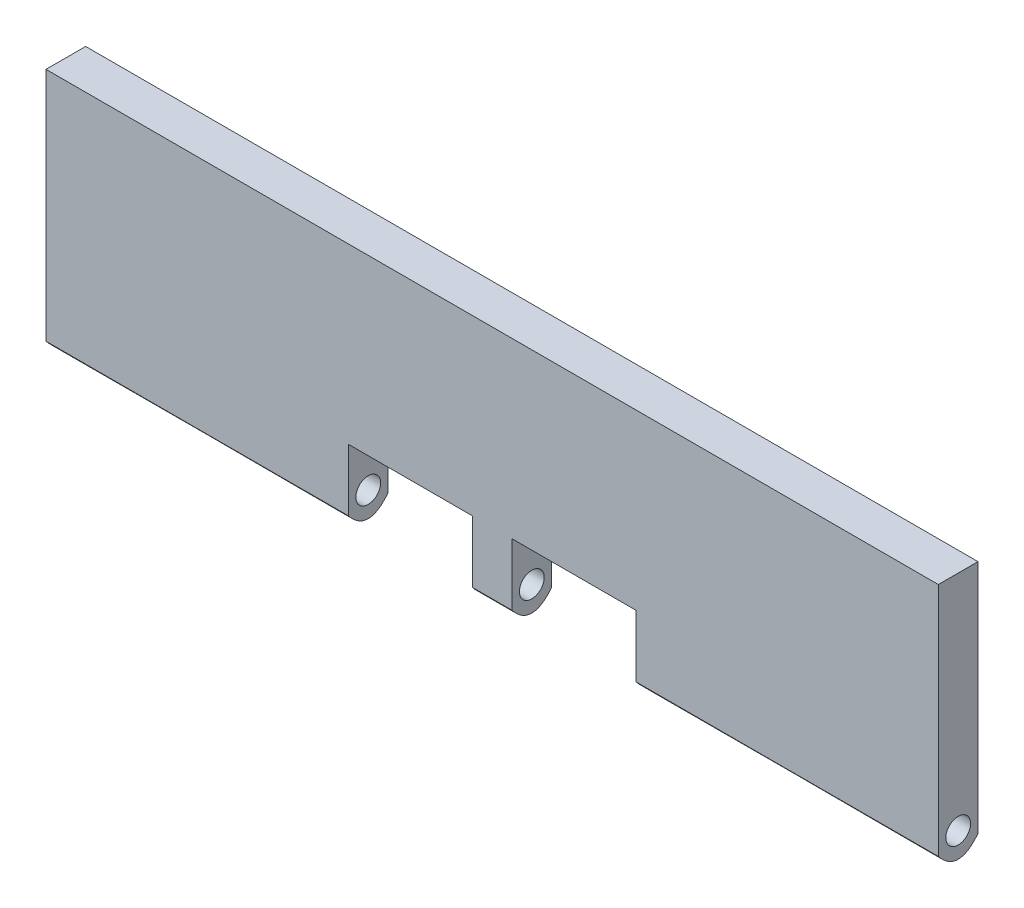
ISO-10303-21;
HEADER;
FILE_DESCRIPTION(('STEP AP214'),'2;1');
FILE_NAME('part.step','',(''),(''),'','','');
FILE_SCHEMA(('AUTOMOTIVE_DESIGN { 1 0 10303 214 1 1 1 1 }'));
ENDSEC;
DATA;
#1=APPLICATION_CONTEXT('core data for automotive mechanical design processes');
#2=APPLICATION_PROTOCOL_DEFINITION('international standard','automotive_design',2000,#1);
#3=PRODUCT_CONTEXT('',#1,'mechanical');
#4=PRODUCT('Part','Part','',(#3));
#5=PRODUCT_RELATED_PRODUCT_CATEGORY('part','',(#4));
#6=PRODUCT_DEFINITION_FORMATION('','',#4);
#7=PRODUCT_DEFINITION_CONTEXT('part definition',#1,'design');
#8=PRODUCT_DEFINITION('design','',#6,#7);
#9=PRODUCT_DEFINITION_SHAPE('','',#8);
#10=(LENGTH_UNIT() NAMED_UNIT(*) SI_UNIT(.MILLI.,.METRE.));
#11=(NAMED_UNIT(*) PLANE_ANGLE_UNIT() SI_UNIT($,.RADIAN.));
#12=(NAMED_UNIT(*) SI_UNIT($,.STERADIAN.) SOLID_ANGLE_UNIT());
#13=UNCERTAINTY_MEASURE_WITH_UNIT(LENGTH_MEASURE(1.E-05),#10,'distance_accuracy_value','');
#14=(GEOMETRIC_REPRESENTATION_CONTEXT(3) GLOBAL_UNCERTAINTY_ASSIGNED_CONTEXT((#13)) GLOBAL_UNIT_ASSIGNED_CONTEXT((#10,
#11,#12)) REPRESENTATION_CONTEXT('',''));
#15=CARTESIAN_POINT('',(0.,0.,0.));
#16=DIRECTION('',(0.,0.,1.));
#17=DIRECTION('',(1.,0.,0.));
#18=AXIS2_PLACEMENT_3D('',#15,#16,#17);
#19=CARTESIAN_POINT('',(0.,0.,0.));
#20=DIRECTION('',(0.,0.,-1.));
#21=DIRECTION('',(-1.,0.,0.));
#22=AXIS2_PLACEMENT_3D('',#19,#20,#21);
#23=PLANE('',#22);
#24=DIRECTION('',(0.,1.,0.));
#25=VECTOR('',#24,1.);
#26=CARTESIAN_POINT('',(90.,-25.,0.));
#27=LINE('',#26,#25);
#28=CARTESIAN_POINT('',(90.,-22.5,0.));
#29=VERTEX_POINT('',#28);
#30=CARTESIAN_POINT('',(90.,25.,0.));
#31=VERTEX_POINT('',#30);
#32=EDGE_CURVE('E324',#29,#31,#27,.T.);
#33=ORIENTED_EDGE('',*,*,#32,.F.);
#34=DIRECTION('',(-1.,0.,0.));
#35=VECTOR('',#34,1.);
#36=CARTESIAN_POINT('',(97.0710678118654,-22.5,0.));
#37=LINE('',#36,#35);
#38=CARTESIAN_POINT('',(29.,-22.5,0.));
#39=VERTEX_POINT('',#38);
#40=EDGE_CURVE('E239',#29,#39,#37,.T.);
#41=ORIENTED_EDGE('',*,*,#40,.T.);
#42=DIRECTION('',(0.,-1.,0.));
#43=VECTOR('',#42,1.);
#44=CARTESIAN_POINT('',(29.,-25.,0.));
#45=LINE('',#44,#43);
#46=CARTESIAN_POINT('',(28.9999999999999,-10.,0.));
#47=VERTEX_POINT('',#46);
#48=EDGE_CURVE('E350',#47,#39,#45,.T.);
#49=ORIENTED_EDGE('',*,*,#48,.F.);
#50=DIRECTION('',(1.,0.,0.));
#51=VECTOR('',#50,1.);
#52=CARTESIAN_POINT('',(28.9999999999999,-10.,0.));
#53=LINE('',#52,#51);
#54=CARTESIAN_POINT('',(3.99999999999994,-10.,0.));
#55=VERTEX_POINT('',#54);
#56=EDGE_CURVE('E348',#55,#47,#53,.T.);
#57=ORIENTED_EDGE('',*,*,#56,.F.);
#58=DIRECTION('',(0.,1.,0.));
#59=VECTOR('',#58,1.);
#60=CARTESIAN_POINT('',(3.99999999999994,-10.,0.));
#61=LINE('',#60,#59);
#62=CARTESIAN_POINT('',(3.99999999999998,-22.5,0.));
#63=VERTEX_POINT('',#62);
#64=EDGE_CURVE('E346',#63,#55,#61,.T.);
#65=ORIENTED_EDGE('',*,*,#64,.F.);
#66=DIRECTION('',(-1.,0.,0.));
#67=VECTOR('',#66,1.);
#68=CARTESIAN_POINT('',(0.,-22.5,0.));
#69=LINE('',#68,#67);
#70=CARTESIAN_POINT('',(-4.,-22.5,0.));
#71=VERTEX_POINT('',#70);
#72=EDGE_CURVE('E12',#63,#71,#69,.T.);
#73=ORIENTED_EDGE('',*,*,#72,.T.);
#74=DIRECTION('',(0.,-1.,0.));
#75=VECTOR('',#74,1.);
#76=CARTESIAN_POINT('',(-4.,-10.,0.));
#77=LINE('',#76,#75);
#78=CARTESIAN_POINT('',(-4.,-10.,0.));
#79=VERTEX_POINT('',#78);
#80=EDGE_CURVE('E343',#79,#71,#77,.T.);
#81=ORIENTED_EDGE('',*,*,#80,.F.);
#82=DIRECTION('',(1.,0.,0.));
#83=VECTOR('',#82,1.);
#84=CARTESIAN_POINT('',(-29.,-10.,0.));
#85=LINE('',#84,#83);
#86=CARTESIAN_POINT('',(-29.,-10.,0.));
#87=VERTEX_POINT('',#86);
#88=EDGE_CURVE('E338',#87,#79,#85,.T.);
#89=ORIENTED_EDGE('',*,*,#88,.F.);
#90=DIRECTION('',(0.,1.,0.));
#91=VECTOR('',#90,1.);
#92=CARTESIAN_POINT('',(-29.,-25.,0.));
#93=LINE('',#92,#91);
#94=CARTESIAN_POINT('',(-29.,-22.5,0.));
#95=VERTEX_POINT('',#94);
#96=EDGE_CURVE('E336',#95,#87,#93,.T.);
#97=ORIENTED_EDGE('',*,*,#96,.F.);
#98=CARTESIAN_POINT('',(-90.,-22.5,0.));
#99=VERTEX_POINT('',#98);
#100=EDGE_CURVE('E76',#95,#99,#69,.T.);
#101=ORIENTED_EDGE('',*,*,#100,.T.);
#102=DIRECTION('',(0.,-1.,0.));
#103=VECTOR('',#102,1.);
#104=CARTESIAN_POINT('',(-90.,-25.,0.));
#105=LINE('',#104,#103);
#106=CARTESIAN_POINT('',(-90.,25.,0.));
#107=VERTEX_POINT('',#106);
#108=EDGE_CURVE('E323',#107,#99,#105,.T.);
#109=ORIENTED_EDGE('',*,*,#108,.F.);
#110=DIRECTION('',(-1.,0.,0.));
#111=VECTOR('',#110,1.);
#112=CARTESIAN_POINT('',(-90.,25.,0.));
#113=LINE('',#112,#111);
#114=EDGE_CURVE('E314',#31,#107,#113,.T.);
#115=ORIENTED_EDGE('',*,*,#114,.F.);
#116=EDGE_LOOP('',(#33,#41,#49,#57,#65,#73,#81,#89,#97,#101,#109,#115));
#117=FACE_BOUND('',#116,.T.);
#118=DIRECTION('',(1.,0.,0.));
#119=VECTOR('',#118,1.);
#120=CARTESIAN_POINT('',(-2.5,4.5,0.));
#121=LINE('',#120,#119);
#122=CARTESIAN_POINT('',(-2.5,4.5,0.));
#123=VERTEX_POINT('',#122);
#124=CARTESIAN_POINT('',(2.5,4.5,0.));
#125=VERTEX_POINT('',#124);
#126=EDGE_CURVE('E88',#123,#125,#121,.T.);
#127=ORIENTED_EDGE('',*,*,#126,.F.);
#128=DIRECTION('',(0.,-1.,0.));
#129=VECTOR('',#128,1.);
#130=CARTESIAN_POINT('',(-2.5,4.5,0.));
#131=LINE('',#130,#129);
#132=CARTESIAN_POINT('',(-2.5,-4.5,0.));
#133=VERTEX_POINT('',#132);
#134=EDGE_CURVE('E83',#123,#133,#131,.T.);
#135=ORIENTED_EDGE('',*,*,#134,.T.);
#136=DIRECTION('',(1.,0.,0.));
#137=VECTOR('',#136,1.);
#138=CARTESIAN_POINT('',(-2.5,-4.5,0.));
#139=LINE('',#138,#137);
#140=CARTESIAN_POINT('',(2.5,-4.5,0.));
#141=VERTEX_POINT('',#140);
#142=EDGE_CURVE('E222',#133,#141,#139,.T.);
#143=ORIENTED_EDGE('',*,*,#142,.T.);
#144=DIRECTION('',(0.,-1.,0.));
#145=VECTOR('',#144,1.);
#146=CARTESIAN_POINT('',(2.5,4.5,0.));
#147=LINE('',#146,#145);
#148=EDGE_CURVE('E196',#125,#141,#147,.T.);
#149=ORIENTED_EDGE('',*,*,#148,.F.);
#150=EDGE_LOOP('',(#127,#135,#143,#149));
#151=FACE_BOUND('',#150,.T.);
#152=ADVANCED_FACE('F67',(#117,#151),#23,.T.);
#153=CARTESIAN_POINT('',(90.,-25.,8.));
#154=DIRECTION('',(-1.,0.,0.));
#155=DIRECTION('',(0.,0.,1.));
#156=AXIS2_PLACEMENT_3D('',#153,#154,#155);
#157=PLANE('',#156);
#158=CARTESIAN_POINT('',(90.,-20.,4.));
#159=DIRECTION('',(-1.,0.,0.));
#160=DIRECTION('',(0.,0.,1.));
#161=AXIS2_PLACEMENT_3D('',#158,#159,#160);
#162=CIRCLE('',#161,2.5);
#163=CARTESIAN_POINT('',(90.,-20.,6.5));
#164=VERTEX_POINT('',#163);
#165=EDGE_CURVE('E227',#164,#164,#162,.F.);
#166=ORIENTED_EDGE('',*,*,#165,.F.);
#167=EDGE_LOOP('',(#166));
#168=FACE_BOUND('',#167,.T.);
#169=CARTESIAN_POINT('',(90.,-22.5,0.));
#170=CARTESIAN_POINT('',(90.,-27.5,4.));
#171=CARTESIAN_POINT('',(90.,-22.5,8.));
#172=B_SPLINE_CURVE_WITH_KNOTS('',2,(#169,#170,#171),.UNSPECIFIED.,.F.,.F.,(3,3),(0.,1.),.UNSPECIFIED.);
#173=CARTESIAN_POINT('',(90.,-22.5,8.));
#174=VERTEX_POINT('',#173);
#175=EDGE_CURVE('E243',#174,#29,#172,.F.);
#176=ORIENTED_EDGE('',*,*,#175,.T.);
#177=ORIENTED_EDGE('',*,*,#32,.T.);
#178=DIRECTION('',(0.,0.,-1.));
#179=VECTOR('',#178,1.);
#180=CARTESIAN_POINT('',(90.,25.,8.));
#181=LINE('',#180,#179);
#182=CARTESIAN_POINT('',(90.,25.,8.));
#183=VERTEX_POINT('',#182);
#184=EDGE_CURVE('E320',#183,#31,#181,.T.);
#185=ORIENTED_EDGE('',*,*,#184,.F.);
#186=DIRECTION('',(0.,1.,0.));
#187=VECTOR('',#186,1.);
#188=CARTESIAN_POINT('',(90.,-25.,8.));
#189=LINE('',#188,#187);
#190=EDGE_CURVE('E353',#174,#183,#189,.T.);
#191=ORIENTED_EDGE('',*,*,#190,.F.);
#192=EDGE_LOOP('',(#176,#177,#185,#191));
#193=FACE_BOUND('',#192,.T.);
#194=ADVANCED_FACE('F69',(#168,#193),#157,.F.);
#195=CARTESIAN_POINT('',(-90.,-25.,8.));
#196=DIRECTION('',(1.,0.,0.));
#197=DIRECTION('',(0.,0.,-1.));
#198=AXIS2_PLACEMENT_3D('',#195,#196,#197);
#199=PLANE('',#198);
#200=CARTESIAN_POINT('',(-90.,-20.,4.));
#201=DIRECTION('',(-1.,0.,0.));
#202=DIRECTION('',(0.,0.,1.));
#203=AXIS2_PLACEMENT_3D('',#200,#201,#202);
#204=CIRCLE('',#203,2.5);
#205=CARTESIAN_POINT('',(-90.,-20.,6.5));
#206=VERTEX_POINT('',#205);
#207=EDGE_CURVE('E221',#206,#206,#204,.T.);
#208=ORIENTED_EDGE('',*,*,#207,.F.);
#209=EDGE_LOOP('',(#208));
#210=FACE_BOUND('',#209,.T.);
#211=ORIENTED_EDGE('',*,*,#108,.T.);
#212=CARTESIAN_POINT('',(-90.,-22.5,0.));
#213=CARTESIAN_POINT('',(-90.,-27.5,4.));
#214=CARTESIAN_POINT('',(-90.,-22.5,8.));
#215=B_SPLINE_CURVE_WITH_KNOTS('',2,(#212,#213,#214),.UNSPECIFIED.,.F.,.F.,(3,3),(0.,1.),.UNSPECIFIED.);
#216=CARTESIAN_POINT('',(-90.,-22.5,8.));
#217=VERTEX_POINT('',#216);
#218=EDGE_CURVE('E242',#99,#217,#215,.T.);
#219=ORIENTED_EDGE('',*,*,#218,.T.);
#220=DIRECTION('',(0.,-1.,0.));
#221=VECTOR('',#220,1.);
#222=CARTESIAN_POINT('',(-90.,-25.,8.));
#223=LINE('',#222,#221);
#224=CARTESIAN_POINT('',(-90.,25.,8.));
#225=VERTEX_POINT('',#224);
#226=EDGE_CURVE('E330',#225,#217,#223,.T.);
#227=ORIENTED_EDGE('',*,*,#226,.F.);
#228=DIRECTION('',(0.,0.,-1.));
#229=VECTOR('',#228,1.);
#230=CARTESIAN_POINT('',(-90.,25.,8.));
#231=LINE('',#230,#229);
#232=EDGE_CURVE('E317',#225,#107,#231,.T.);
#233=ORIENTED_EDGE('',*,*,#232,.T.);
#234=EDGE_LOOP('',(#211,#219,#227,#233));
#235=FACE_BOUND('',#234,.T.);
#236=ADVANCED_FACE('F303',(#210,#235),#199,.F.);
#237=CARTESIAN_POINT('',(-29.,-25.,8.));
#238=DIRECTION('',(-1.,0.,0.));
#239=DIRECTION('',(0.,-1.,0.));
#240=AXIS2_PLACEMENT_3D('',#237,#238,#239);
#241=PLANE('',#240);
#242=CARTESIAN_POINT('',(-29.,-20.,4.));
#243=DIRECTION('',(-1.,0.,0.));
#244=DIRECTION('',(0.,-1.,0.));
#245=AXIS2_PLACEMENT_3D('',#242,#243,#244);
#246=CIRCLE('',#245,2.5);
#247=CARTESIAN_POINT('',(-29.,-22.5,4.));
#248=VERTEX_POINT('',#247);
#249=EDGE_CURVE('E236',#248,#248,#246,.T.);
#250=ORIENTED_EDGE('',*,*,#249,.T.);
#251=EDGE_LOOP('',(#250));
#252=FACE_BOUND('',#251,.T.);
#253=CARTESIAN_POINT('',(-29.,-22.5,0.));
#254=CARTESIAN_POINT('',(-29.,-27.5,4.));
#255=CARTESIAN_POINT('',(-29.,-22.5,8.));
#256=B_SPLINE_CURVE_WITH_KNOTS('',2,(#253,#254,#255),.UNSPECIFIED.,.F.,.F.,(3,3),(0.,1.),.UNSPECIFIED.);
#257=CARTESIAN_POINT('',(-29.,-22.5,8.));
#258=VERTEX_POINT('',#257);
#259=EDGE_CURVE('E381',#95,#258,#256,.T.);
#260=ORIENTED_EDGE('',*,*,#259,.F.);
#261=ORIENTED_EDGE('',*,*,#96,.T.);
#262=DIRECTION('',(0.,0.,-1.));
#263=VECTOR('',#262,1.);
#264=CARTESIAN_POINT('',(-29.,-10.,8.));
#265=LINE('',#264,#263);
#266=CARTESIAN_POINT('',(-29.,-10.,8.));
#267=VERTEX_POINT('',#266);
#268=EDGE_CURVE('E331',#267,#87,#265,.T.);
#269=ORIENTED_EDGE('',*,*,#268,.F.);
#270=DIRECTION('',(0.,1.,0.));
#271=VECTOR('',#270,1.);
#272=CARTESIAN_POINT('',(-29.,-25.,8.));
#273=LINE('',#272,#271);
#274=EDGE_CURVE('E391',#258,#267,#273,.T.);
#275=ORIENTED_EDGE('',*,*,#274,.F.);
#276=EDGE_LOOP('',(#260,#261,#269,#275));
#277=FACE_BOUND('',#276,.T.);
#278=ADVANCED_FACE('F296',(#252,#277),#241,.F.);
#279=CARTESIAN_POINT('',(-4.,-10.,8.));
#280=DIRECTION('',(1.,0.,0.));
#281=DIRECTION('',(0.,1.,0.));
#282=AXIS2_PLACEMENT_3D('',#279,#280,#281);
#283=PLANE('',#282);
#284=CARTESIAN_POINT('',(-4.,-20.,4.));
#285=DIRECTION('',(1.,0.,0.));
#286=DIRECTION('',(0.,1.,0.));
#287=AXIS2_PLACEMENT_3D('',#284,#285,#286);
#288=CIRCLE('',#287,2.5);
#289=CARTESIAN_POINT('',(-4.,-17.5,4.));
#290=VERTEX_POINT('',#289);
#291=EDGE_CURVE('E233',#290,#290,#288,.T.);
#292=ORIENTED_EDGE('',*,*,#291,.T.);
#293=EDGE_LOOP('',(#292));
#294=FACE_BOUND('',#293,.T.);
#295=ORIENTED_EDGE('',*,*,#80,.T.);
#296=CARTESIAN_POINT('',(-4.,-22.5,0.));
#297=CARTESIAN_POINT('',(-4.,-27.5,4.));
#298=CARTESIAN_POINT('',(-4.,-22.5,8.));
#299=B_SPLINE_CURVE_WITH_KNOTS('',2,(#296,#297,#298),.UNSPECIFIED.,.F.,.F.,(3,3),(0.,1.),.UNSPECIFIED.);
#300=CARTESIAN_POINT('',(-4.,-22.5,8.));
#301=VERTEX_POINT('',#300);
#302=EDGE_CURVE('E373',#301,#71,#299,.F.);
#303=ORIENTED_EDGE('',*,*,#302,.F.);
#304=DIRECTION('',(0.,-1.,0.));
#305=VECTOR('',#304,1.);
#306=CARTESIAN_POINT('',(-4.,-10.,8.));
#307=LINE('',#306,#305);
#308=CARTESIAN_POINT('',(-4.,-10.,8.));
#309=VERTEX_POINT('',#308);
#310=EDGE_CURVE('E379',#309,#301,#307,.T.);
#311=ORIENTED_EDGE('',*,*,#310,.F.);
#312=DIRECTION('',(0.,0.,-1.));
#313=VECTOR('',#312,1.);
#314=CARTESIAN_POINT('',(-4.,-10.,8.));
#315=LINE('',#314,#313);
#316=EDGE_CURVE('E361',#309,#79,#315,.T.);
#317=ORIENTED_EDGE('',*,*,#316,.T.);
#318=EDGE_LOOP('',(#295,#303,#311,#317));
#319=FACE_BOUND('',#318,.T.);
#320=ADVANCED_FACE('F292',(#294,#319),#283,.F.);
#321=CARTESIAN_POINT('',(3.99999999999994,-10.,8.));
#322=DIRECTION('',(-1.,0.,0.));
#323=DIRECTION('',(0.,-1.,0.));
#324=AXIS2_PLACEMENT_3D('',#321,#322,#323);
#325=PLANE('',#324);
#326=CARTESIAN_POINT('',(3.99999999999999,-20.,4.));
#327=DIRECTION('',(-1.,0.,0.));
#328=DIRECTION('',(0.,-1.,0.));
#329=AXIS2_PLACEMENT_3D('',#326,#327,#328);
#330=CIRCLE('',#329,2.5);
#331=CARTESIAN_POINT('',(4.,-22.5,4.));
#332=VERTEX_POINT('',#331);
#333=EDGE_CURVE('E230',#332,#332,#330,.T.);
#334=ORIENTED_EDGE('',*,*,#333,.T.);
#335=EDGE_LOOP('',(#334));
#336=FACE_BOUND('',#335,.T.);
#337=CARTESIAN_POINT('',(3.99999999999995,-22.5,0.));
#338=CARTESIAN_POINT('',(3.99999999999995,-27.5,4.));
#339=CARTESIAN_POINT('',(3.99999999999995,-22.5,8.));
#340=B_SPLINE_CURVE_WITH_KNOTS('',2,(#337,#338,#339),.UNSPECIFIED.,.F.,.F.,(3,3),(0.,1.),.UNSPECIFIED.);
#341=CARTESIAN_POINT('',(3.99999999999999,-22.5,8.));
#342=VERTEX_POINT('',#341);
#343=EDGE_CURVE('E374',#63,#342,#340,.T.);
#344=ORIENTED_EDGE('',*,*,#343,.F.);
#345=ORIENTED_EDGE('',*,*,#64,.T.);
#346=DIRECTION('',(0.,0.,-1.));
#347=VECTOR('',#346,1.);
#348=CARTESIAN_POINT('',(3.99999999999994,-10.,8.));
#349=LINE('',#348,#347);
#350=CARTESIAN_POINT('',(3.99999999999994,-10.,8.));
#351=VERTEX_POINT('',#350);
#352=EDGE_CURVE('E357',#351,#55,#349,.T.);
#353=ORIENTED_EDGE('',*,*,#352,.F.);
#354=DIRECTION('',(0.,1.,0.));
#355=VECTOR('',#354,1.);
#356=CARTESIAN_POINT('',(3.99999999999994,-10.,8.));
#357=LINE('',#356,#355);
#358=EDGE_CURVE('E387',#342,#351,#357,.T.);
#359=ORIENTED_EDGE('',*,*,#358,.F.);
#360=EDGE_LOOP('',(#344,#345,#353,#359));
#361=FACE_BOUND('',#360,.T.);
#362=ADVANCED_FACE('F284',(#336,#361),#325,.F.);
#363=CARTESIAN_POINT('',(29.,-25.,8.));
#364=DIRECTION('',(1.,0.,0.));
#365=DIRECTION('',(0.,1.,0.));
#366=AXIS2_PLACEMENT_3D('',#363,#364,#365);
#367=PLANE('',#366);
#368=CARTESIAN_POINT('',(29.,-20.,4.));
#369=DIRECTION('',(1.,0.,0.));
#370=DIRECTION('',(0.,1.,0.));
#371=AXIS2_PLACEMENT_3D('',#368,#369,#370);
#372=CIRCLE('',#371,2.5);
#373=CARTESIAN_POINT('',(29.,-17.5,4.));
#374=VERTEX_POINT('',#373);
#375=EDGE_CURVE('E71',#374,#374,#372,.T.);
#376=ORIENTED_EDGE('',*,*,#375,.T.);
#377=EDGE_LOOP('',(#376));
#378=FACE_BOUND('',#377,.T.);
#379=ORIENTED_EDGE('',*,*,#48,.T.);
#380=CARTESIAN_POINT('',(29.,-22.5,0.));
#381=CARTESIAN_POINT('',(29.,-27.5,4.));
#382=CARTESIAN_POINT('',(29.,-22.5,8.));
#383=B_SPLINE_CURVE_WITH_KNOTS('',2,(#380,#381,#382),.UNSPECIFIED.,.F.,.F.,(3,3),(0.,1.),.UNSPECIFIED.);
#384=CARTESIAN_POINT('',(29.,-22.5,8.));
#385=VERTEX_POINT('',#384);
#386=EDGE_CURVE('E247',#385,#39,#383,.F.);
#387=ORIENTED_EDGE('',*,*,#386,.F.);
#388=DIRECTION('',(0.,-1.,0.));
#389=VECTOR('',#388,1.);
#390=CARTESIAN_POINT('',(29.,-25.,8.));
#391=LINE('',#390,#389);
#392=CARTESIAN_POINT('',(28.9999999999999,-10.,8.));
#393=VERTEX_POINT('',#392);
#394=EDGE_CURVE('E358',#393,#385,#391,.T.);
#395=ORIENTED_EDGE('',*,*,#394,.F.);
#396=DIRECTION('',(0.,0.,-1.));
#397=VECTOR('',#396,1.);
#398=CARTESIAN_POINT('',(28.9999999999999,-10.,8.));
#399=LINE('',#398,#397);
#400=EDGE_CURVE('E354',#393,#47,#399,.T.);
#401=ORIENTED_EDGE('',*,*,#400,.T.);
#402=EDGE_LOOP('',(#379,#387,#395,#401));
#403=FACE_BOUND('',#402,.T.);
#404=ADVANCED_FACE('F277',(#378,#403),#367,.F.);
#405=CARTESIAN_POINT('',(0.,0.,8.));
#406=DIRECTION('',(0.,0.,-1.));
#407=DIRECTION('',(-1.,0.,0.));
#408=AXIS2_PLACEMENT_3D('',#405,#406,#407);
#409=PLANE('',#408);
#410=DIRECTION('',(-1.,0.,0.));
#411=VECTOR('',#410,1.);
#412=CARTESIAN_POINT('',(97.0710678118654,-22.5,8.));
#413=LINE('',#412,#411);
#414=EDGE_CURVE('E248',#174,#385,#413,.T.);
#415=ORIENTED_EDGE('',*,*,#414,.F.);
#416=ORIENTED_EDGE('',*,*,#190,.T.);
#417=DIRECTION('',(-1.,0.,0.));
#418=VECTOR('',#417,1.);
#419=CARTESIAN_POINT('',(-90.,25.,8.));
#420=LINE('',#419,#418);
#421=EDGE_CURVE('E410',#183,#225,#420,.T.);
#422=ORIENTED_EDGE('',*,*,#421,.T.);
#423=ORIENTED_EDGE('',*,*,#226,.T.);
#424=DIRECTION('',(-1.,0.,0.));
#425=VECTOR('',#424,1.);
#426=CARTESIAN_POINT('',(0.,-22.5,8.));
#427=LINE('',#426,#425);
#428=EDGE_CURVE('E367',#258,#217,#427,.T.);
#429=ORIENTED_EDGE('',*,*,#428,.F.);
#430=ORIENTED_EDGE('',*,*,#274,.T.);
#431=DIRECTION('',(1.,0.,0.));
#432=VECTOR('',#431,1.);
#433=CARTESIAN_POINT('',(-29.,-10.,8.));
#434=LINE('',#433,#432);
#435=EDGE_CURVE('E385',#267,#309,#434,.T.);
#436=ORIENTED_EDGE('',*,*,#435,.T.);
#437=ORIENTED_EDGE('',*,*,#310,.T.);
#438=EDGE_CURVE('E368',#342,#301,#427,.T.);
#439=ORIENTED_EDGE('',*,*,#438,.F.);
#440=ORIENTED_EDGE('',*,*,#358,.T.);
#441=DIRECTION('',(1.,0.,0.));
#442=VECTOR('',#441,1.);
#443=CARTESIAN_POINT('',(28.9999999999999,-10.,8.));
#444=LINE('',#443,#442);
#445=EDGE_CURVE('E389',#351,#393,#444,.T.);
#446=ORIENTED_EDGE('',*,*,#445,.T.);
#447=ORIENTED_EDGE('',*,*,#394,.T.);
#448=EDGE_LOOP('',(#415,#416,#422,#423,#429,#430,#436,#437,#439,#440,#446,#447));
#449=FACE_BOUND('',#448,.T.);
#450=ADVANCED_FACE('F273',(#449),#409,.F.);
#451=CARTESIAN_POINT('',(-90.,25.,8.));
#452=DIRECTION('',(0.,-1.,0.));
#453=DIRECTION('',(0.,0.,-1.));
#454=AXIS2_PLACEMENT_3D('',#451,#452,#453);
#455=PLANE('',#454);
#456=ORIENTED_EDGE('',*,*,#114,.T.);
#457=ORIENTED_EDGE('',*,*,#232,.F.);
#458=ORIENTED_EDGE('',*,*,#421,.F.);
#459=ORIENTED_EDGE('',*,*,#184,.T.);
#460=EDGE_LOOP('',(#456,#457,#458,#459));
#461=FACE_BOUND('',#460,.T.);
#462=ADVANCED_FACE('F276',(#461),#455,.F.);
#463=CARTESIAN_POINT('',(-29.,-10.,8.));
#464=DIRECTION('',(0.,1.,0.));
#465=DIRECTION('',(0.,0.,1.));
#466=AXIS2_PLACEMENT_3D('',#463,#464,#465);
#467=PLANE('',#466);
#468=ORIENTED_EDGE('',*,*,#88,.T.);
#469=ORIENTED_EDGE('',*,*,#316,.F.);
#470=ORIENTED_EDGE('',*,*,#435,.F.);
#471=ORIENTED_EDGE('',*,*,#268,.T.);
#472=EDGE_LOOP('',(#468,#469,#470,#471));
#473=FACE_BOUND('',#472,.T.);
#474=ADVANCED_FACE('F288',(#473),#467,.F.);
#475=CARTESIAN_POINT('',(28.9999999999999,-10.,8.));
#476=DIRECTION('',(0.,1.,0.));
#477=DIRECTION('',(-1.,0.,0.));
#478=AXIS2_PLACEMENT_3D('',#475,#476,#477);
#479=PLANE('',#478);
#480=ORIENTED_EDGE('',*,*,#56,.T.);
#481=ORIENTED_EDGE('',*,*,#400,.F.);
#482=ORIENTED_EDGE('',*,*,#445,.F.);
#483=ORIENTED_EDGE('',*,*,#352,.T.);
#484=EDGE_LOOP('',(#480,#481,#482,#483));
#485=FACE_BOUND('',#484,.T.);
#486=ADVANCED_FACE('F268',(#485),#479,.F.);
#487=CARTESIAN_POINT('',(97.0710678118654,-22.5,0.));
#488=CARTESIAN_POINT('',(97.0710678118654,-27.5,4.));
#489=CARTESIAN_POINT('',(97.0710678118654,-22.5,8.));
#490=B_SPLINE_CURVE_WITH_KNOTS('',2,(#487,#488,#489),.UNSPECIFIED.,.F.,.F.,(3,3),(0.,1.),.UNSPECIFIED.);
#491=DIRECTION('',(-1.,0.,0.));
#492=VECTOR('',#491,1.);
#493=SURFACE_OF_LINEAR_EXTRUSION('',#490,#492);
#494=ORIENTED_EDGE('',*,*,#259,.T.);
#495=ORIENTED_EDGE('',*,*,#428,.T.);
#496=ORIENTED_EDGE('',*,*,#218,.F.);
#497=ORIENTED_EDGE('',*,*,#100,.F.);
#498=EDGE_LOOP('',(#494,#495,#496,#497));
#499=FACE_BOUND('',#498,.T.);
#500=ADVANCED_FACE('F263',(#499),#493,.T.);
#501=ORIENTED_EDGE('',*,*,#302,.T.);
#502=ORIENTED_EDGE('',*,*,#72,.F.);
#503=ORIENTED_EDGE('',*,*,#343,.T.);
#504=ORIENTED_EDGE('',*,*,#438,.T.);
#505=EDGE_LOOP('',(#501,#502,#503,#504));
#506=FACE_BOUND('',#505,.T.);
#507=ADVANCED_FACE('F267',(#506),#493,.T.);
#508=ORIENTED_EDGE('',*,*,#386,.T.);
#509=ORIENTED_EDGE('',*,*,#40,.F.);
#510=ORIENTED_EDGE('',*,*,#175,.F.);
#511=ORIENTED_EDGE('',*,*,#414,.T.);
#512=EDGE_LOOP('',(#508,#509,#510,#511));
#513=FACE_BOUND('',#512,.T.);
#514=ADVANCED_FACE('F270',(#513),#493,.T.);
#515=CARTESIAN_POINT('',(97.0710678118654,-20.,4.));
#516=DIRECTION('',(-1.,0.,0.));
#517=DIRECTION('',(0.,0.,1.));
#518=AXIS2_PLACEMENT_3D('',#515,#516,#517);
#519=CYLINDRICAL_SURFACE('',#518,2.5);
#520=ORIENTED_EDGE('',*,*,#165,.T.);
#521=EDGE_LOOP('',(#520));
#522=FACE_BOUND('',#521,.T.);
#523=ORIENTED_EDGE('',*,*,#375,.F.);
#524=EDGE_LOOP('',(#523));
#525=FACE_BOUND('',#524,.T.);
#526=ADVANCED_FACE('F441',(#522,#525),#519,.F.);
#527=ORIENTED_EDGE('',*,*,#333,.F.);
#528=EDGE_LOOP('',(#527));
#529=FACE_BOUND('',#528,.T.);
#530=ORIENTED_EDGE('',*,*,#291,.F.);
#531=EDGE_LOOP('',(#530));
#532=FACE_BOUND('',#531,.T.);
#533=ADVANCED_FACE('F446',(#529,#532),#519,.F.);
#534=ORIENTED_EDGE('',*,*,#207,.T.);
#535=EDGE_LOOP('',(#534));
#536=FACE_BOUND('',#535,.T.);
#537=ORIENTED_EDGE('',*,*,#249,.F.);
#538=EDGE_LOOP('',(#537));
#539=FACE_BOUND('',#538,.T.);
#540=ADVANCED_FACE('F271',(#536,#539),#519,.F.);
#541=CARTESIAN_POINT('',(-2.5,0.,-5.));
#542=DIRECTION('',(1.,0.,0.));
#543=DIRECTION('',(0.,0.,-1.));
#544=AXIS2_PLACEMENT_3D('',#541,#542,#543);
#545=CYLINDRICAL_SURFACE('',#544,4.5);
#546=DIRECTION('',(1.,0.,0.));
#547=VECTOR('',#546,1.);
#548=CARTESIAN_POINT('',(-2.5,4.5,-5.));
#549=LINE('',#548,#547);
#550=CARTESIAN_POINT('',(-2.5,4.5,-5.));
#551=VERTEX_POINT('',#550);
#552=CARTESIAN_POINT('',(2.5,4.5,-5.));
#553=VERTEX_POINT('',#552);
#554=EDGE_CURVE('E179',#551,#553,#549,.T.);
#555=ORIENTED_EDGE('',*,*,#554,.T.);
#556=CARTESIAN_POINT('',(2.5,0.,-5.));
#557=DIRECTION('',(1.,0.,0.));
#558=DIRECTION('',(0.,0.,-1.));
#559=AXIS2_PLACEMENT_3D('',#556,#557,#558);
#560=CIRCLE('',#559,4.5);
#561=CARTESIAN_POINT('',(2.5,-4.5,-5.));
#562=VERTEX_POINT('',#561);
#563=EDGE_CURVE('E183',#562,#553,#560,.T.);
#564=ORIENTED_EDGE('',*,*,#563,.F.);
#565=DIRECTION('',(1.,0.,0.));
#566=VECTOR('',#565,1.);
#567=CARTESIAN_POINT('',(-2.5,-4.5,-5.));
#568=LINE('',#567,#566);
#569=CARTESIAN_POINT('',(-2.5,-4.5,-5.));
#570=VERTEX_POINT('',#569);
#571=EDGE_CURVE('E219',#570,#562,#568,.T.);
#572=ORIENTED_EDGE('',*,*,#571,.F.);
#573=CARTESIAN_POINT('',(-2.5,0.,-5.));
#574=DIRECTION('',(1.,0.,0.));
#575=DIRECTION('',(0.,0.,-1.));
#576=AXIS2_PLACEMENT_3D('',#573,#574,#575);
#577=CIRCLE('',#576,4.5);
#578=EDGE_CURVE('E185',#570,#551,#577,.T.);
#579=ORIENTED_EDGE('',*,*,#578,.T.);
#580=EDGE_LOOP('',(#555,#564,#572,#579));
#581=FACE_BOUND('',#580,.T.);
#582=ADVANCED_FACE('F181',(#581),#545,.T.);
#583=CARTESIAN_POINT('',(-2.5,-4.5,-5.));
#584=DIRECTION('',(0.,-1.,0.));
#585=DIRECTION('',(0.,0.,-1.));
#586=AXIS2_PLACEMENT_3D('',#583,#584,#585);
#587=PLANE('',#586);
#588=ORIENTED_EDGE('',*,*,#571,.T.);
#589=DIRECTION('',(0.,0.,-1.));
#590=VECTOR('',#589,1.);
#591=CARTESIAN_POINT('',(2.5,-4.5,-5.));
#592=LINE('',#591,#590);
#593=EDGE_CURVE('E202',#141,#562,#592,.T.);
#594=ORIENTED_EDGE('',*,*,#593,.F.);
#595=ORIENTED_EDGE('',*,*,#142,.F.);
#596=DIRECTION('',(0.,0.,-1.));
#597=VECTOR('',#596,1.);
#598=CARTESIAN_POINT('',(-2.5,-4.5,-5.));
#599=LINE('',#598,#597);
#600=EDGE_CURVE('E189',#133,#570,#599,.T.);
#601=ORIENTED_EDGE('',*,*,#600,.T.);
#602=EDGE_LOOP('',(#588,#594,#595,#601));
#603=FACE_BOUND('',#602,.T.);
#604=ADVANCED_FACE('F557',(#603),#587,.T.);
#605=CARTESIAN_POINT('',(-2.5,4.5,-5.));
#606=DIRECTION('',(0.,1.,0.));
#607=DIRECTION('',(0.,0.,1.));
#608=AXIS2_PLACEMENT_3D('',#605,#606,#607);
#609=PLANE('',#608);
#610=ORIENTED_EDGE('',*,*,#126,.T.);
#611=DIRECTION('',(0.,0.,1.));
#612=VECTOR('',#611,1.);
#613=CARTESIAN_POINT('',(2.5,4.5,-5.));
#614=LINE('',#613,#612);
#615=EDGE_CURVE('E192',#553,#125,#614,.T.);
#616=ORIENTED_EDGE('',*,*,#615,.F.);
#617=ORIENTED_EDGE('',*,*,#554,.F.);
#618=DIRECTION('',(0.,0.,1.));
#619=VECTOR('',#618,1.);
#620=CARTESIAN_POINT('',(-2.5,4.5,-5.));
#621=LINE('',#620,#619);
#622=EDGE_CURVE('E214',#551,#123,#621,.T.);
#623=ORIENTED_EDGE('',*,*,#622,.T.);
#624=EDGE_LOOP('',(#610,#616,#617,#623));
#625=FACE_BOUND('',#624,.T.);
#626=ADVANCED_FACE('F193',(#625),#609,.T.);
#627=CARTESIAN_POINT('',(-2.5,0.,-5.));
#628=DIRECTION('',(1.,0.,0.));
#629=DIRECTION('',(0.,0.,-1.));
#630=AXIS2_PLACEMENT_3D('',#627,#628,#629);
#631=PLANE('',#630);
#632=CARTESIAN_POINT('',(-2.5,0.,-5.));
#633=DIRECTION('',(1.,0.,0.));
#634=DIRECTION('',(0.,0.,-1.));
#635=AXIS2_PLACEMENT_3D('',#632,#633,#634);
#636=CIRCLE('',#635,2.5);
#637=CARTESIAN_POINT('',(-2.5,0.,-7.5));
#638=VERTEX_POINT('',#637);
#639=EDGE_CURVE('E210',#638,#638,#636,.T.);
#640=ORIENTED_EDGE('',*,*,#639,.T.);
#641=EDGE_LOOP('',(#640));
#642=FACE_BOUND('',#641,.T.);
#643=ORIENTED_EDGE('',*,*,#578,.F.);
#644=ORIENTED_EDGE('',*,*,#600,.F.);
#645=ORIENTED_EDGE('',*,*,#134,.F.);
#646=ORIENTED_EDGE('',*,*,#622,.F.);
#647=EDGE_LOOP('',(#643,#644,#645,#646));
#648=FACE_BOUND('',#647,.T.);
#649=ADVANCED_FACE('F572',(#642,#648),#631,.F.);
#650=CARTESIAN_POINT('',(-2.5,0.,-5.));
#651=DIRECTION('',(1.,0.,0.));
#652=DIRECTION('',(0.,0.,-1.));
#653=AXIS2_PLACEMENT_3D('',#650,#651,#652);
#654=CYLINDRICAL_SURFACE('',#653,2.5);
#655=ORIENTED_EDGE('',*,*,#639,.F.);
#656=EDGE_LOOP('',(#655));
#657=FACE_BOUND('',#656,.T.);
#658=CARTESIAN_POINT('',(2.5,0.,-5.));
#659=DIRECTION('',(1.,0.,0.));
#660=DIRECTION('',(0.,0.,-1.));
#661=AXIS2_PLACEMENT_3D('',#658,#659,#660);
#662=CIRCLE('',#661,2.5);
#663=CARTESIAN_POINT('',(2.5,0.,-7.5));
#664=VERTEX_POINT('',#663);
#665=EDGE_CURVE('E203',#664,#664,#662,.T.);
#666=ORIENTED_EDGE('',*,*,#665,.T.);
#667=EDGE_LOOP('',(#666));
#668=FACE_BOUND('',#667,.T.);
#669=ADVANCED_FACE('F580',(#657,#668),#654,.F.);
#670=CARTESIAN_POINT('',(2.5,0.,-5.));
#671=DIRECTION('',(1.,0.,0.));
#672=DIRECTION('',(0.,0.,-1.));
#673=AXIS2_PLACEMENT_3D('',#670,#671,#672);
#674=PLANE('',#673);
#675=ORIENTED_EDGE('',*,*,#563,.T.);
#676=ORIENTED_EDGE('',*,*,#615,.T.);
#677=ORIENTED_EDGE('',*,*,#148,.T.);
#678=ORIENTED_EDGE('',*,*,#593,.T.);
#679=EDGE_LOOP('',(#675,#676,#677,#678));
#680=FACE_BOUND('',#679,.T.);
#681=ORIENTED_EDGE('',*,*,#665,.F.);
#682=EDGE_LOOP('',(#681));
#683=FACE_BOUND('',#682,.T.);
#684=ADVANCED_FACE('F199',(#680,#683),#674,.T.);
#685=CLOSED_SHELL('',(#152,#194,#236,#278,#320,#362,#404,#450,#462,#474,#486,#500,#507,#514,
#526,#533,#540,#582,#604,#626,#649,#669,#684));
#686=MANIFOLD_SOLID_BREP('B2',#685);
#687=ADVANCED_BREP_SHAPE_REPRESENTATION('',(#18,#686),#14);
#688=SHAPE_DEFINITION_REPRESENTATION(#9,#687);
ENDSEC;
END-ISO-10303-21;
